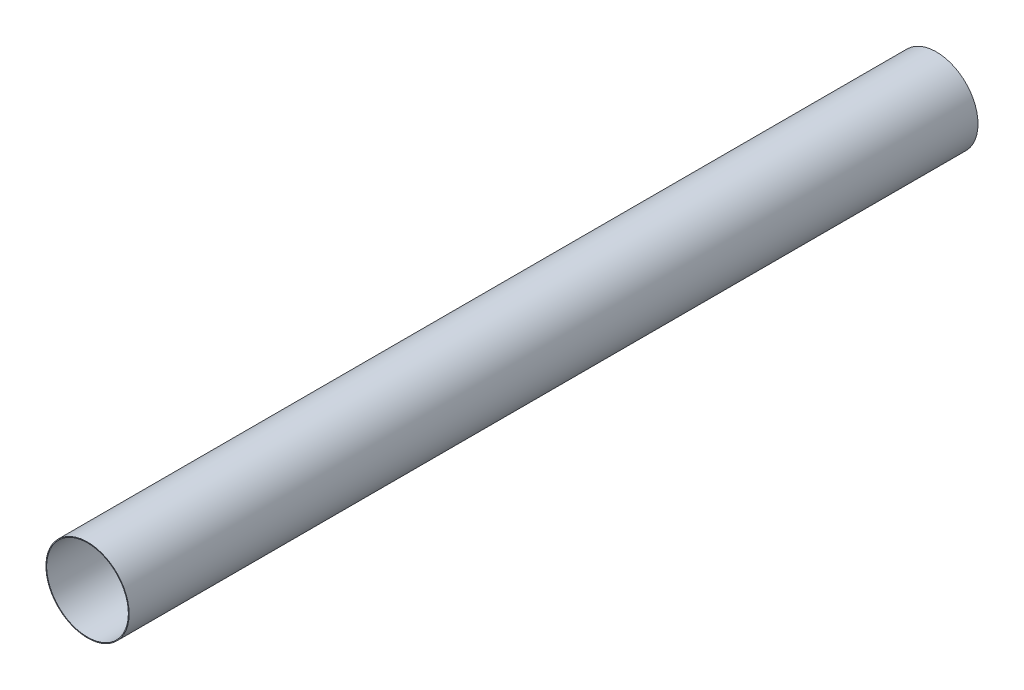
ISO-10303-21;
HEADER;
FILE_DESCRIPTION(('STEP AP214'),'2;1');
FILE_NAME('part.step','',(''),(''),'','','');
FILE_SCHEMA(('AUTOMOTIVE_DESIGN { 1 0 10303 214 1 1 1 1 }'));
ENDSEC;
DATA;
#1=APPLICATION_CONTEXT('core data for automotive mechanical design processes');
#2=APPLICATION_PROTOCOL_DEFINITION('international standard','automotive_design',2000,#1);
#3=PRODUCT_CONTEXT('',#1,'mechanical');
#4=PRODUCT('Part','Part','',(#3));
#5=PRODUCT_RELATED_PRODUCT_CATEGORY('part','',(#4));
#6=PRODUCT_DEFINITION_FORMATION('','',#4);
#7=PRODUCT_DEFINITION_CONTEXT('part definition',#1,'design');
#8=PRODUCT_DEFINITION('design','',#6,#7);
#9=PRODUCT_DEFINITION_SHAPE('','',#8);
#10=(LENGTH_UNIT() NAMED_UNIT(*) SI_UNIT(.MILLI.,.METRE.));
#11=(NAMED_UNIT(*) PLANE_ANGLE_UNIT() SI_UNIT($,.RADIAN.));
#12=(NAMED_UNIT(*) SI_UNIT($,.STERADIAN.) SOLID_ANGLE_UNIT());
#13=UNCERTAINTY_MEASURE_WITH_UNIT(LENGTH_MEASURE(1.E-05),#10,'distance_accuracy_value','');
#14=(GEOMETRIC_REPRESENTATION_CONTEXT(3) GLOBAL_UNCERTAINTY_ASSIGNED_CONTEXT((#13)) GLOBAL_UNIT_ASSIGNED_CONTEXT((#10,
#11,#12)) REPRESENTATION_CONTEXT('',''));
#15=CARTESIAN_POINT('',(0.,0.,0.));
#16=DIRECTION('',(0.,0.,1.));
#17=DIRECTION('',(1.,0.,0.));
#18=AXIS2_PLACEMENT_3D('',#15,#16,#17);
#19=CARTESIAN_POINT('',(0.,0.,1143.));
#20=DIRECTION('',(0.,0.,1.));
#21=DIRECTION('',(1.,0.,0.));
#22=AXIS2_PLACEMENT_3D('',#19,#20,#21);
#23=PLANE('',#22);
#24=CARTESIAN_POINT('',(0.,0.,1143.));
#25=DIRECTION('',(0.,0.,1.));
#26=DIRECTION('',(1.,0.,0.));
#27=AXIS2_PLACEMENT_3D('',#24,#25,#26);
#28=CIRCLE('',#27,56.);
#29=CARTESIAN_POINT('',(56.,0.,1143.));
#30=VERTEX_POINT('',#29);
#31=EDGE_CURVE('E10',#30,#30,#28,.T.);
#32=ORIENTED_EDGE('',*,*,#31,.T.);
#33=EDGE_LOOP('',(#32));
#34=FACE_BOUND('',#33,.T.);
#35=CARTESIAN_POINT('',(0.,0.,1143.));
#36=DIRECTION('',(0.,0.,1.));
#37=DIRECTION('',(1.,0.,0.));
#38=AXIS2_PLACEMENT_3D('',#35,#36,#37);
#39=CIRCLE('',#38,55.);
#40=CARTESIAN_POINT('',(55.,0.,1143.));
#41=VERTEX_POINT('',#40);
#42=EDGE_CURVE('E46',#41,#41,#39,.T.);
#43=ORIENTED_EDGE('',*,*,#42,.F.);
#44=EDGE_LOOP('',(#43));
#45=FACE_BOUND('',#44,.T.);
#46=ADVANCED_FACE('F35',(#34,#45),#23,.T.);
#47=CARTESIAN_POINT('',(0.,0.,0.));
#48=DIRECTION('',(0.,0.,1.));
#49=DIRECTION('',(1.,0.,0.));
#50=AXIS2_PLACEMENT_3D('',#47,#48,#49);
#51=PLANE('',#50);
#52=CARTESIAN_POINT('',(0.,0.,0.));
#53=DIRECTION('',(0.,0.,1.));
#54=DIRECTION('',(1.,0.,0.));
#55=AXIS2_PLACEMENT_3D('',#52,#53,#54);
#56=CIRCLE('',#55,56.);
#57=CARTESIAN_POINT('',(56.,0.,0.));
#58=VERTEX_POINT('',#57);
#59=EDGE_CURVE('E39',#58,#58,#56,.T.);
#60=ORIENTED_EDGE('',*,*,#59,.F.);
#61=EDGE_LOOP('',(#60));
#62=FACE_BOUND('',#61,.T.);
#63=CARTESIAN_POINT('',(0.,0.,0.));
#64=DIRECTION('',(0.,0.,1.));
#65=DIRECTION('',(1.,0.,0.));
#66=AXIS2_PLACEMENT_3D('',#63,#64,#65);
#67=CIRCLE('',#66,55.);
#68=CARTESIAN_POINT('',(55.,0.,0.));
#69=VERTEX_POINT('',#68);
#70=EDGE_CURVE('E48',#69,#69,#67,.T.);
#71=ORIENTED_EDGE('',*,*,#70,.T.);
#72=EDGE_LOOP('',(#71));
#73=FACE_BOUND('',#72,.T.);
#74=ADVANCED_FACE('F58',(#62,#73),#51,.F.);
#75=CARTESIAN_POINT('',(0.,0.,1143.));
#76=DIRECTION('',(0.,0.,-1.));
#77=DIRECTION('',(-1.,0.,0.));
#78=AXIS2_PLACEMENT_3D('',#75,#76,#77);
#79=CYLINDRICAL_SURFACE('',#78,56.);
#80=ORIENTED_EDGE('',*,*,#31,.F.);
#81=EDGE_LOOP('',(#80));
#82=FACE_BOUND('',#81,.T.);
#83=ORIENTED_EDGE('',*,*,#59,.T.);
#84=EDGE_LOOP('',(#83));
#85=FACE_BOUND('',#84,.T.);
#86=ADVANCED_FACE('F37',(#82,#85),#79,.T.);
#87=CARTESIAN_POINT('',(0.,0.,1143.));
#88=DIRECTION('',(0.,0.,-1.));
#89=DIRECTION('',(-1.,0.,0.));
#90=AXIS2_PLACEMENT_3D('',#87,#88,#89);
#91=CYLINDRICAL_SURFACE('',#90,55.);
#92=ORIENTED_EDGE('',*,*,#42,.T.);
#93=EDGE_LOOP('',(#92));
#94=FACE_BOUND('',#93,.T.);
#95=ORIENTED_EDGE('',*,*,#70,.F.);
#96=EDGE_LOOP('',(#95));
#97=FACE_BOUND('',#96,.T.);
#98=ADVANCED_FACE('F54',(#94,#97),#91,.F.);
#99=CLOSED_SHELL('',(#46,#74,#86,#98));
#100=MANIFOLD_SOLID_BREP('B2',#99);
#101=ADVANCED_BREP_SHAPE_REPRESENTATION('',(#18,#100),#14);
#102=SHAPE_DEFINITION_REPRESENTATION(#9,#101);
ENDSEC;
END-ISO-10303-21;
